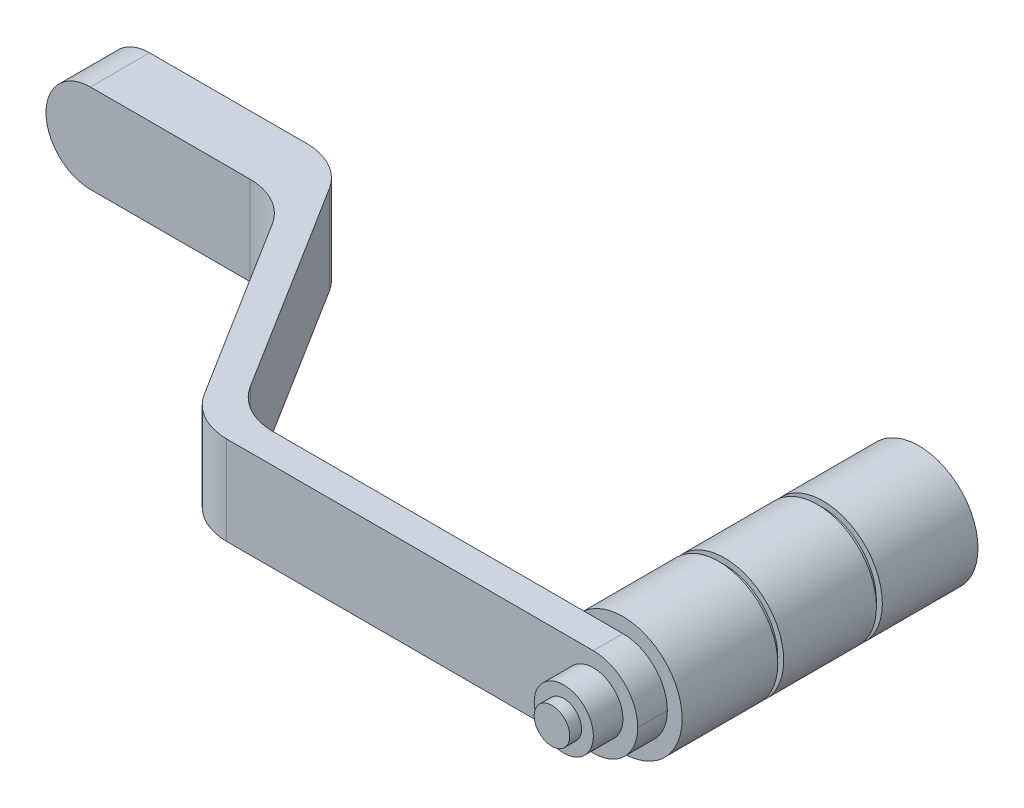
ISO-10303-21;
HEADER;
FILE_DESCRIPTION(('STEP AP214'),'2;1');
FILE_NAME('part.step','',(''),(''),'','','');
FILE_SCHEMA(('AUTOMOTIVE_DESIGN { 1 0 10303 214 1 1 1 1 }'));
ENDSEC;
DATA;
#1=APPLICATION_CONTEXT('core data for automotive mechanical design processes');
#2=APPLICATION_PROTOCOL_DEFINITION('international standard','automotive_design',2000,#1);
#3=PRODUCT_CONTEXT('',#1,'mechanical');
#4=PRODUCT('Part','Part','',(#3));
#5=PRODUCT_RELATED_PRODUCT_CATEGORY('part','',(#4));
#6=PRODUCT_DEFINITION_FORMATION('','',#4);
#7=PRODUCT_DEFINITION_CONTEXT('part definition',#1,'design');
#8=PRODUCT_DEFINITION('design','',#6,#7);
#9=PRODUCT_DEFINITION_SHAPE('','',#8);
#10=(LENGTH_UNIT() NAMED_UNIT(*) SI_UNIT(.MILLI.,.METRE.));
#11=(NAMED_UNIT(*) PLANE_ANGLE_UNIT() SI_UNIT($,.RADIAN.));
#12=(NAMED_UNIT(*) SI_UNIT($,.STERADIAN.) SOLID_ANGLE_UNIT());
#13=UNCERTAINTY_MEASURE_WITH_UNIT(LENGTH_MEASURE(1.E-05),#10,'distance_accuracy_value','');
#14=(GEOMETRIC_REPRESENTATION_CONTEXT(3) GLOBAL_UNCERTAINTY_ASSIGNED_CONTEXT((#13)) GLOBAL_UNIT_ASSIGNED_CONTEXT((#10,
#11,#12)) REPRESENTATION_CONTEXT('',''));
#15=CARTESIAN_POINT('',(0.,0.,0.));
#16=DIRECTION('',(0.,0.,1.));
#17=DIRECTION('',(1.,0.,0.));
#18=AXIS2_PLACEMENT_3D('',#15,#16,#17);
#19=CARTESIAN_POINT('',(9.525,0.,0.));
#20=DIRECTION('',(0.,0.,-1.));
#21=DIRECTION('',(-1.,0.,0.));
#22=AXIS2_PLACEMENT_3D('',#19,#20,#21);
#23=CYLINDRICAL_SURFACE('',#22,9.525);
#24=DIRECTION('',(0.,0.,1.));
#25=VECTOR('',#24,1.);
#26=CARTESIAN_POINT('',(0.,0.,-6.35));
#27=LINE('',#26,#25);
#28=CARTESIAN_POINT('',(0.,0.,-2.794));
#29=VERTEX_POINT('',#28);
#30=CARTESIAN_POINT('',(0.,0.,-6.35));
#31=VERTEX_POINT('',#30);
#32=EDGE_CURVE('E210',#29,#31,#27,.F.);
#33=ORIENTED_EDGE('',*,*,#32,.F.);
#34=CARTESIAN_POINT('',(9.52500000000011,0.,-2.794));
#35=DIRECTION('',(0.,0.,1.));
#36=DIRECTION('',(1.,0.,0.));
#37=AXIS2_PLACEMENT_3D('',#34,#35,#36);
#38=CIRCLE('',#37,9.52500000000011);
#39=CARTESIAN_POINT('',(0.567447725522335,3.2385,-2.794));
#40=VERTEX_POINT('',#39);
#41=EDGE_CURVE('E203',#40,#29,#38,.T.);
#42=ORIENTED_EDGE('',*,*,#41,.F.);
#43=DIRECTION('',(0.,0.,1.));
#44=VECTOR('',#43,1.);
#45=CARTESIAN_POINT('',(0.567447725522335,3.2385,-2.794));
#46=LINE('',#45,#44);
#47=CARTESIAN_POINT('',(0.567447725522335,3.2385,2.794));
#48=VERTEX_POINT('',#47);
#49=EDGE_CURVE('E188',#40,#48,#46,.T.);
#50=ORIENTED_EDGE('',*,*,#49,.T.);
#51=CARTESIAN_POINT('',(9.52500000000011,0.,2.794));
#52=DIRECTION('',(0.,0.,1.));
#53=DIRECTION('',(1.,0.,0.));
#54=AXIS2_PLACEMENT_3D('',#51,#52,#53);
#55=CIRCLE('',#54,9.52500000000011);
#56=CARTESIAN_POINT('',(0.,0.,2.794));
#57=VERTEX_POINT('',#56);
#58=EDGE_CURVE('E223',#48,#57,#55,.T.);
#59=ORIENTED_EDGE('',*,*,#58,.T.);
#60=CARTESIAN_POINT('',(0.,0.,6.35));
#61=VERTEX_POINT('',#60);
#62=EDGE_CURVE('E351',#61,#57,#27,.F.);
#63=ORIENTED_EDGE('',*,*,#62,.F.);
#64=CARTESIAN_POINT('',(9.525,0.,6.35));
#65=DIRECTION('',(0.,0.,-1.));
#66=DIRECTION('',(-1.,0.,0.));
#67=AXIS2_PLACEMENT_3D('',#64,#65,#66);
#68=CIRCLE('',#67,9.525);
#69=CARTESIAN_POINT('',(9.525,9.525,6.35));
#70=VERTEX_POINT('',#69);
#71=EDGE_CURVE('E338',#70,#61,#68,.F.);
#72=ORIENTED_EDGE('',*,*,#71,.F.);
#73=DIRECTION('',(0.,0.,1.));
#74=VECTOR('',#73,1.);
#75=CARTESIAN_POINT('',(9.525,9.525,6.35));
#76=LINE('',#75,#74);
#77=CARTESIAN_POINT('',(9.525,9.525,-6.35));
#78=VERTEX_POINT('',#77);
#79=EDGE_CURVE('E334',#78,#70,#76,.T.);
#80=ORIENTED_EDGE('',*,*,#79,.F.);
#81=CARTESIAN_POINT('',(9.525,0.,-6.35));
#82=DIRECTION('',(0.,0.,1.));
#83=DIRECTION('',(1.,0.,0.));
#84=AXIS2_PLACEMENT_3D('',#81,#82,#83);
#85=CIRCLE('',#84,9.525);
#86=EDGE_CURVE('E342',#31,#78,#85,.F.);
#87=ORIENTED_EDGE('',*,*,#86,.F.);
#88=EDGE_LOOP('',(#33,#42,#50,#59,#63,#72,#80,#87));
#89=FACE_BOUND('',#88,.T.);
#90=ADVANCED_FACE('F37',(#89),#23,.T.);
#91=CARTESIAN_POINT('',(9.525,0.,6.35));
#92=DIRECTION('',(0.,0.,1.));
#93=DIRECTION('',(1.,0.,0.));
#94=AXIS2_PLACEMENT_3D('',#91,#92,#93);
#95=CYLINDRICAL_SURFACE('',#94,9.525);
#96=DIRECTION('',(0.,0.,1.));
#97=VECTOR('',#96,1.);
#98=CARTESIAN_POINT('',(0.567447725522336,-3.2385,-2.794));
#99=LINE('',#98,#97);
#100=CARTESIAN_POINT('',(0.567447725522336,-3.2385,-2.794));
#101=VERTEX_POINT('',#100);
#102=CARTESIAN_POINT('',(0.567447725522334,-3.2385,2.794));
#103=VERTEX_POINT('',#102);
#104=EDGE_CURVE('E198',#101,#103,#99,.T.);
#105=ORIENTED_EDGE('',*,*,#104,.F.);
#106=CARTESIAN_POINT('',(9.525,0.,-2.794));
#107=DIRECTION('',(0.,0.,1.));
#108=DIRECTION('',(1.,0.,0.));
#109=AXIS2_PLACEMENT_3D('',#106,#107,#108);
#110=CIRCLE('',#109,9.525);
#111=EDGE_CURVE('E12',#101,#29,#110,.F.);
#112=ORIENTED_EDGE('',*,*,#111,.T.);
#113=ORIENTED_EDGE('',*,*,#32,.T.);
#114=CARTESIAN_POINT('',(9.525,0.,-6.35));
#115=DIRECTION('',(0.,0.,1.));
#116=DIRECTION('',(1.,0.,0.));
#117=AXIS2_PLACEMENT_3D('',#114,#115,#116);
#118=CIRCLE('',#117,9.525);
#119=CARTESIAN_POINT('',(9.525,-9.525,-6.35));
#120=VERTEX_POINT('',#119);
#121=EDGE_CURVE('E345',#120,#31,#118,.F.);
#122=ORIENTED_EDGE('',*,*,#121,.F.);
#123=DIRECTION('',(0.,0.,1.));
#124=VECTOR('',#123,1.);
#125=CARTESIAN_POINT('',(9.525,-9.525,0.));
#126=LINE('',#125,#124);
#127=CARTESIAN_POINT('',(9.525,-9.525,6.35));
#128=VERTEX_POINT('',#127);
#129=EDGE_CURVE('E323',#128,#120,#126,.F.);
#130=ORIENTED_EDGE('',*,*,#129,.F.);
#131=CARTESIAN_POINT('',(9.525,0.,6.35));
#132=DIRECTION('',(0.,0.,-1.));
#133=DIRECTION('',(-1.,0.,0.));
#134=AXIS2_PLACEMENT_3D('',#131,#132,#133);
#135=CIRCLE('',#134,9.525);
#136=EDGE_CURVE('E340',#61,#128,#135,.F.);
#137=ORIENTED_EDGE('',*,*,#136,.F.);
#138=ORIENTED_EDGE('',*,*,#62,.T.);
#139=CARTESIAN_POINT('',(9.525,0.,2.794));
#140=DIRECTION('',(0.,0.,1.));
#141=DIRECTION('',(1.,0.,0.));
#142=AXIS2_PLACEMENT_3D('',#139,#140,#141);
#143=CIRCLE('',#142,9.525);
#144=EDGE_CURVE('E45',#103,#57,#143,.F.);
#145=ORIENTED_EDGE('',*,*,#144,.F.);
#146=EDGE_LOOP('',(#105,#112,#113,#122,#130,#137,#138,#145));
#147=FACE_BOUND('',#146,.T.);
#148=ADVANCED_FACE('F398',(#147),#95,.T.);
#149=CARTESIAN_POINT('',(0.,9.525,6.35));
#150=DIRECTION('',(0.,0.,-1.));
#151=DIRECTION('',(-1.,0.,0.));
#152=AXIS2_PLACEMENT_3D('',#149,#150,#151);
#153=PLANE('',#152);
#154=DIRECTION('',(1.,0.,0.));
#155=VECTOR('',#154,1.);
#156=CARTESIAN_POINT('',(0.,-9.525,6.35));
#157=LINE('',#156,#155);
#158=CARTESIAN_POINT('',(43.7610549528601,-9.525,6.35));
#159=VERTEX_POINT('',#158);
#160=EDGE_CURVE('E301',#128,#159,#157,.T.);
#161=ORIENTED_EDGE('',*,*,#160,.T.);
#162=DIRECTION('',(0.,-1.,0.));
#163=VECTOR('',#162,1.);
#164=CARTESIAN_POINT('',(43.7610549528601,9.525,6.35));
#165=LINE('',#164,#163);
#166=CARTESIAN_POINT('',(43.7610549528601,9.525,6.35));
#167=VERTEX_POINT('',#166);
#168=EDGE_CURVE('E379',#159,#167,#165,.F.);
#169=ORIENTED_EDGE('',*,*,#168,.T.);
#170=DIRECTION('',(1.,0.,0.));
#171=VECTOR('',#170,1.);
#172=CARTESIAN_POINT('',(0.,9.525,6.35));
#173=LINE('',#172,#171);
#174=EDGE_CURVE('E284',#70,#167,#173,.T.);
#175=ORIENTED_EDGE('',*,*,#174,.F.);
#176=ORIENTED_EDGE('',*,*,#71,.T.);
#177=ORIENTED_EDGE('',*,*,#136,.T.);
#178=EDGE_LOOP('',(#161,#169,#175,#176,#177));
#179=FACE_BOUND('',#178,.T.);
#180=ADVANCED_FACE('F403',(#179),#153,.F.);
#181=CARTESIAN_POINT('',(50.8,9.525,6.35));
#182=DIRECTION('',(0.847998304005088,0.,-0.52999894000318));
#183=DIRECTION('',(-0.52999894000318,0.,-0.847998304005088));
#184=AXIS2_PLACEMENT_3D('',#181,#182,#183);
#185=PLANE('',#184);
#186=DIRECTION('',(0.52999894000318,0.,0.847998304005088));
#187=VECTOR('',#186,1.);
#188=CARTESIAN_POINT('',(50.8,-9.525,6.35));
#189=LINE('',#188,#187);
#190=CARTESIAN_POINT('',(54.5306334137248,-9.525,12.3190134619596));
#191=VERTEX_POINT('',#190);
#192=CARTESIAN_POINT('',(78.8193665862753,-9.525,51.1809865380404));
#193=VERTEX_POINT('',#192);
#194=EDGE_CURVE('E304',#191,#193,#189,.T.);
#195=ORIENTED_EDGE('',*,*,#194,.T.);
#196=DIRECTION('',(0.,-1.,0.));
#197=VECTOR('',#196,1.);
#198=CARTESIAN_POINT('',(78.8193665862753,9.525,51.1809865380404));
#199=LINE('',#198,#197);
#200=CARTESIAN_POINT('',(78.8193665862753,9.525,51.1809865380404));
#201=VERTEX_POINT('',#200);
#202=EDGE_CURVE('E377',#193,#201,#199,.F.);
#203=ORIENTED_EDGE('',*,*,#202,.T.);
#204=DIRECTION('',(0.52999894000318,0.,0.847998304005088));
#205=VECTOR('',#204,1.);
#206=CARTESIAN_POINT('',(50.8,9.525,6.35));
#207=LINE('',#206,#205);
#208=CARTESIAN_POINT('',(54.5306334137248,9.525,12.3190134619596));
#209=VERTEX_POINT('',#208);
#210=EDGE_CURVE('E287',#209,#201,#207,.T.);
#211=ORIENTED_EDGE('',*,*,#210,.F.);
#212=DIRECTION('',(0.,-1.,0.));
#213=VECTOR('',#212,1.);
#214=CARTESIAN_POINT('',(54.5306334137248,-9.525,12.3190134619596));
#215=LINE('',#214,#213);
#216=EDGE_CURVE('E374',#209,#191,#215,.T.);
#217=ORIENTED_EDGE('',*,*,#216,.T.);
#218=EDGE_LOOP('',(#195,#203,#211,#217));
#219=FACE_BOUND('',#218,.T.);
#220=ADVANCED_FACE('F415',(#219),#185,.F.);
#221=CARTESIAN_POINT('',(82.55,9.525,57.15));
#222=DIRECTION('',(0.,0.,-1.));
#223=DIRECTION('',(-1.,0.,0.));
#224=AXIS2_PLACEMENT_3D('',#221,#222,#223);
#225=PLANE('',#224);
#226=CARTESIAN_POINT('',(168.275,0.,57.15));
#227=DIRECTION('',(0.,0.,-1.));
#228=DIRECTION('',(-1.,0.,0.));
#229=AXIS2_PLACEMENT_3D('',#226,#227,#228);
#230=CIRCLE('',#229,6.35);
#231=CARTESIAN_POINT('',(161.925,0.,57.15));
#232=VERTEX_POINT('',#231);
#233=EDGE_CURVE('E250',#232,#232,#230,.F.);
#234=ORIENTED_EDGE('',*,*,#233,.F.);
#235=EDGE_LOOP('',(#234));
#236=FACE_BOUND('',#235,.T.);
#237=DIRECTION('',(1.,0.,0.));
#238=VECTOR('',#237,1.);
#239=CARTESIAN_POINT('',(82.55,9.525,57.15));
#240=LINE('',#239,#238);
#241=CARTESIAN_POINT('',(89.5889450471399,9.525,57.15));
#242=VERTEX_POINT('',#241);
#243=CARTESIAN_POINT('',(168.275,9.525,57.15));
#244=VERTEX_POINT('',#243);
#245=EDGE_CURVE('E291',#242,#244,#240,.T.);
#246=ORIENTED_EDGE('',*,*,#245,.F.);
#247=DIRECTION('',(0.,-1.,0.));
#248=VECTOR('',#247,1.);
#249=CARTESIAN_POINT('',(89.5889450471399,9.525,57.15));
#250=LINE('',#249,#248);
#251=CARTESIAN_POINT('',(89.5889450471399,-9.525,57.15));
#252=VERTEX_POINT('',#251);
#253=EDGE_CURVE('E371',#242,#252,#250,.T.);
#254=ORIENTED_EDGE('',*,*,#253,.T.);
#255=DIRECTION('',(1.,0.,0.));
#256=VECTOR('',#255,1.);
#257=CARTESIAN_POINT('',(82.55,-9.525,57.15));
#258=LINE('',#257,#256);
#259=CARTESIAN_POINT('',(168.275,-9.525,57.15));
#260=VERTEX_POINT('',#259);
#261=EDGE_CURVE('E308',#252,#260,#258,.T.);
#262=ORIENTED_EDGE('',*,*,#261,.T.);
#263=CARTESIAN_POINT('',(168.275,0.,57.15));
#264=DIRECTION('',(0.,0.,-1.));
#265=DIRECTION('',(-1.,0.,0.));
#266=AXIS2_PLACEMENT_3D('',#263,#264,#265);
#267=CIRCLE('',#266,9.525);
#268=CARTESIAN_POINT('',(177.8,0.,57.15));
#269=VERTEX_POINT('',#268);
#270=EDGE_CURVE('E332',#260,#269,#267,.F.);
#271=ORIENTED_EDGE('',*,*,#270,.T.);
#272=CARTESIAN_POINT('',(168.275,0.,57.15));
#273=DIRECTION('',(0.,0.,-1.));
#274=DIRECTION('',(-1.,0.,0.));
#275=AXIS2_PLACEMENT_3D('',#272,#273,#274);
#276=CIRCLE('',#275,9.525);
#277=EDGE_CURVE('E329',#269,#244,#276,.F.);
#278=ORIENTED_EDGE('',*,*,#277,.T.);
#279=EDGE_LOOP('',(#246,#254,#262,#271,#278));
#280=FACE_BOUND('',#279,.T.);
#281=ADVANCED_FACE('F426',(#236,#280),#225,.F.);
#282=CARTESIAN_POINT('',(86.0694725235699,9.525,50.8));
#283=DIRECTION('',(0.,0.,1.));
#284=DIRECTION('',(1.,0.,0.));
#285=AXIS2_PLACEMENT_3D('',#282,#283,#284);
#286=PLANE('',#285);
#287=CARTESIAN_POINT('',(168.275,0.,50.8));
#288=DIRECTION('',(0.,0.,-1.));
#289=DIRECTION('',(-1.,0.,0.));
#290=AXIS2_PLACEMENT_3D('',#287,#288,#289);
#291=CIRCLE('',#290,12.7);
#292=CARTESIAN_POINT('',(159.87473958737,-9.525,50.8));
#293=VERTEX_POINT('',#292);
#294=CARTESIAN_POINT('',(159.87473958737,9.525,50.8));
#295=VERTEX_POINT('',#294);
#296=EDGE_CURVE('E275',#293,#295,#291,.T.);
#297=ORIENTED_EDGE('',*,*,#296,.F.);
#298=DIRECTION('',(-1.,0.,0.));
#299=VECTOR('',#298,1.);
#300=CARTESIAN_POINT('',(86.0694725235699,-9.525,50.8));
#301=LINE('',#300,#299);
#302=CARTESIAN_POINT('',(93.1084175707098,-9.525,50.8));
#303=VERTEX_POINT('',#302);
#304=EDGE_CURVE('E310',#293,#303,#301,.T.);
#305=ORIENTED_EDGE('',*,*,#304,.T.);
#306=DIRECTION('',(0.,-1.,0.));
#307=VECTOR('',#306,1.);
#308=CARTESIAN_POINT('',(93.1084175707098,9.525,50.8));
#309=LINE('',#308,#307);
#310=CARTESIAN_POINT('',(93.1084175707098,9.525,50.8));
#311=VERTEX_POINT('',#310);
#312=EDGE_CURVE('E369',#303,#311,#309,.F.);
#313=ORIENTED_EDGE('',*,*,#312,.T.);
#314=DIRECTION('',(-1.,0.,0.));
#315=VECTOR('',#314,1.);
#316=CARTESIAN_POINT('',(86.0694725235699,9.525,50.8));
#317=LINE('',#316,#315);
#318=EDGE_CURVE('E60',#295,#311,#317,.T.);
#319=ORIENTED_EDGE('',*,*,#318,.F.);
#320=EDGE_LOOP('',(#297,#305,#313,#319));
#321=FACE_BOUND('',#320,.T.);
#322=ADVANCED_FACE('F487',(#321),#286,.F.);
#323=CARTESIAN_POINT('',(50.3507225235699,9.525,-6.35));
#324=DIRECTION('',(-0.847998304005088,0.,0.52999894000318));
#325=DIRECTION('',(0.52999894000318,0.,0.847998304005088));
#326=AXIS2_PLACEMENT_3D('',#323,#324,#325);
#327=PLANE('',#326);
#328=DIRECTION('',(-0.52999894000318,0.,-0.847998304005088));
#329=VECTOR('',#328,1.);
#330=CARTESIAN_POINT('',(50.3507225235699,-9.525,-6.35));
#331=LINE('',#330,#329);
#332=CARTESIAN_POINT('',(82.3388391098452,-9.525,44.8309865380404));
#333=VERTEX_POINT('',#332);
#334=CARTESIAN_POINT('',(54.0813559372947,-9.525,-0.380986538040386));
#335=VERTEX_POINT('',#334);
#336=EDGE_CURVE('E314',#333,#335,#331,.T.);
#337=ORIENTED_EDGE('',*,*,#336,.T.);
#338=DIRECTION('',(0.,-1.,0.));
#339=VECTOR('',#338,1.);
#340=CARTESIAN_POINT('',(54.0813559372947,9.525,-0.380986538040387));
#341=LINE('',#340,#339);
#342=CARTESIAN_POINT('',(54.0813559372947,9.525,-0.380986538040386));
#343=VERTEX_POINT('',#342);
#344=EDGE_CURVE('E363',#335,#343,#341,.F.);
#345=ORIENTED_EDGE('',*,*,#344,.T.);
#346=DIRECTION('',(-0.52999894000318,0.,-0.847998304005088));
#347=VECTOR('',#346,1.);
#348=CARTESIAN_POINT('',(50.3507225235699,9.525,-6.35));
#349=LINE('',#348,#347);
#350=CARTESIAN_POINT('',(82.3388391098452,9.525,44.8309865380404));
#351=VERTEX_POINT('',#350);
#352=EDGE_CURVE('E295',#351,#343,#349,.T.);
#353=ORIENTED_EDGE('',*,*,#352,.F.);
#354=DIRECTION('',(0.,-1.,0.));
#355=VECTOR('',#354,1.);
#356=CARTESIAN_POINT('',(82.3388391098452,-9.525,44.8309865380404));
#357=LINE('',#356,#355);
#358=EDGE_CURVE('E360',#351,#333,#357,.T.);
#359=ORIENTED_EDGE('',*,*,#358,.T.);
#360=EDGE_LOOP('',(#337,#345,#353,#359));
#361=FACE_BOUND('',#360,.T.);
#362=ADVANCED_FACE('F492',(#361),#327,.F.);
#363=CARTESIAN_POINT('',(0.,9.525,-6.35));
#364=DIRECTION('',(0.,0.,1.));
#365=DIRECTION('',(1.,0.,0.));
#366=AXIS2_PLACEMENT_3D('',#363,#364,#365);
#367=PLANE('',#366);
#368=DIRECTION('',(-1.,0.,0.));
#369=VECTOR('',#368,1.);
#370=CARTESIAN_POINT('',(0.,9.525,-6.35));
#371=LINE('',#370,#369);
#372=CARTESIAN_POINT('',(43.3117774764301,9.525,-6.35));
#373=VERTEX_POINT('',#372);
#374=EDGE_CURVE('E298',#373,#78,#371,.T.);
#375=ORIENTED_EDGE('',*,*,#374,.F.);
#376=DIRECTION('',(0.,-1.,0.));
#377=VECTOR('',#376,1.);
#378=CARTESIAN_POINT('',(43.3117774764301,9.525,-6.35));
#379=LINE('',#378,#377);
#380=CARTESIAN_POINT('',(43.3117774764301,-9.525,-6.35));
#381=VERTEX_POINT('',#380);
#382=EDGE_CURVE('E348',#373,#381,#379,.T.);
#383=ORIENTED_EDGE('',*,*,#382,.T.);
#384=DIRECTION('',(-1.,0.,0.));
#385=VECTOR('',#384,1.);
#386=CARTESIAN_POINT('',(0.,-9.525,-6.35));
#387=LINE('',#386,#385);
#388=EDGE_CURVE('E288',#381,#120,#387,.T.);
#389=ORIENTED_EDGE('',*,*,#388,.T.);
#390=ORIENTED_EDGE('',*,*,#121,.T.);
#391=ORIENTED_EDGE('',*,*,#86,.T.);
#392=EDGE_LOOP('',(#375,#383,#389,#390,#391));
#393=FACE_BOUND('',#392,.T.);
#394=ADVANCED_FACE('F505',(#393),#367,.F.);
#395=CARTESIAN_POINT('',(0.,9.525,0.));
#396=DIRECTION('',(0.,1.,0.));
#397=DIRECTION('',(0.,0.,1.));
#398=AXIS2_PLACEMENT_3D('',#395,#396,#397);
#399=PLANE('',#398);
#400=ORIENTED_EDGE('',*,*,#352,.T.);
#401=CARTESIAN_POINT('',(43.3117774764301,9.525,6.35));
#402=DIRECTION('',(0.,1.,0.));
#403=DIRECTION('',(0.,0.,1.));
#404=AXIS2_PLACEMENT_3D('',#401,#402,#403);
#405=CIRCLE('',#404,12.7);
#406=EDGE_CURVE('E367',#343,#373,#405,.T.);
#407=ORIENTED_EDGE('',*,*,#406,.T.);
#408=ORIENTED_EDGE('',*,*,#374,.T.);
#409=ORIENTED_EDGE('',*,*,#79,.T.);
#410=ORIENTED_EDGE('',*,*,#174,.T.);
#411=CARTESIAN_POINT('',(43.7610549528601,9.525,19.05));
#412=DIRECTION('',(0.,1.,0.));
#413=DIRECTION('',(0.,0.,1.));
#414=AXIS2_PLACEMENT_3D('',#411,#412,#413);
#415=CIRCLE('',#414,12.7);
#416=EDGE_CURVE('E388',#167,#209,#415,.F.);
#417=ORIENTED_EDGE('',*,*,#416,.T.);
#418=ORIENTED_EDGE('',*,*,#210,.T.);
#419=CARTESIAN_POINT('',(89.5889450471399,9.525,44.45));
#420=DIRECTION('',(0.,1.,0.));
#421=DIRECTION('',(0.,0.,1.));
#422=AXIS2_PLACEMENT_3D('',#419,#420,#421);
#423=CIRCLE('',#422,12.7);
#424=EDGE_CURVE('E365',#201,#242,#423,.T.);
#425=ORIENTED_EDGE('',*,*,#424,.T.);
#426=ORIENTED_EDGE('',*,*,#245,.T.);
#427=DIRECTION('',(0.,0.,-1.));
#428=VECTOR('',#427,1.);
#429=CARTESIAN_POINT('',(168.275,9.525,50.8));
#430=LINE('',#429,#428);
#431=CARTESIAN_POINT('',(168.275,9.525,50.8));
#432=VERTEX_POINT('',#431);
#433=EDGE_CURVE('E336',#244,#432,#430,.T.);
#434=ORIENTED_EDGE('',*,*,#433,.T.);
#435=EDGE_CURVE('E293',#432,#295,#317,.T.);
#436=ORIENTED_EDGE('',*,*,#435,.T.);
#437=ORIENTED_EDGE('',*,*,#318,.T.);
#438=CARTESIAN_POINT('',(93.1084175707098,9.525,38.1));
#439=DIRECTION('',(0.,1.,0.));
#440=DIRECTION('',(0.,0.,1.));
#441=AXIS2_PLACEMENT_3D('',#438,#439,#440);
#442=CIRCLE('',#441,12.7);
#443=EDGE_CURVE('E384',#311,#351,#442,.F.);
#444=ORIENTED_EDGE('',*,*,#443,.T.);
#445=EDGE_LOOP('',(#400,#407,#408,#409,#410,#417,#418,#425,#426,#434,#436,#437,#444));
#446=FACE_BOUND('',#445,.T.);
#447=ADVANCED_FACE('F419',(#446),#399,.T.);
#448=CARTESIAN_POINT('',(0.,-9.525,0.));
#449=DIRECTION('',(0.,1.,0.));
#450=DIRECTION('',(0.,0.,1.));
#451=AXIS2_PLACEMENT_3D('',#448,#449,#450);
#452=PLANE('',#451);
#453=ORIENTED_EDGE('',*,*,#388,.F.);
#454=CARTESIAN_POINT('',(43.3117774764301,-9.525,6.35));
#455=DIRECTION('',(0.,1.,0.));
#456=DIRECTION('',(0.,0.,1.));
#457=AXIS2_PLACEMENT_3D('',#454,#455,#456);
#458=CIRCLE('',#457,12.7);
#459=EDGE_CURVE('E358',#381,#335,#458,.F.);
#460=ORIENTED_EDGE('',*,*,#459,.T.);
#461=ORIENTED_EDGE('',*,*,#336,.F.);
#462=CARTESIAN_POINT('',(93.1084175707098,-9.525,38.1));
#463=DIRECTION('',(0.,1.,0.));
#464=DIRECTION('',(0.,0.,1.));
#465=AXIS2_PLACEMENT_3D('',#462,#463,#464);
#466=CIRCLE('',#465,12.7);
#467=EDGE_CURVE('E381',#333,#303,#466,.T.);
#468=ORIENTED_EDGE('',*,*,#467,.T.);
#469=ORIENTED_EDGE('',*,*,#304,.F.);
#470=CARTESIAN_POINT('',(168.275,-9.525,50.8));
#471=VERTEX_POINT('',#470);
#472=EDGE_CURVE('E311',#471,#293,#301,.T.);
#473=ORIENTED_EDGE('',*,*,#472,.F.);
#474=DIRECTION('',(0.,0.,-1.));
#475=VECTOR('',#474,1.);
#476=CARTESIAN_POINT('',(168.275,-9.525,0.));
#477=LINE('',#476,#475);
#478=EDGE_CURVE('E326',#471,#260,#477,.F.);
#479=ORIENTED_EDGE('',*,*,#478,.T.);
#480=ORIENTED_EDGE('',*,*,#261,.F.);
#481=CARTESIAN_POINT('',(89.5889450471399,-9.525,44.45));
#482=DIRECTION('',(0.,1.,0.));
#483=DIRECTION('',(0.,0.,1.));
#484=AXIS2_PLACEMENT_3D('',#481,#482,#483);
#485=CIRCLE('',#484,12.7);
#486=EDGE_CURVE('E356',#252,#193,#485,.F.);
#487=ORIENTED_EDGE('',*,*,#486,.T.);
#488=ORIENTED_EDGE('',*,*,#194,.F.);
#489=CARTESIAN_POINT('',(43.7610549528601,-9.525,19.05));
#490=DIRECTION('',(0.,1.,0.));
#491=DIRECTION('',(0.,0.,1.));
#492=AXIS2_PLACEMENT_3D('',#489,#490,#491);
#493=CIRCLE('',#492,12.7);
#494=EDGE_CURVE('E386',#191,#159,#493,.T.);
#495=ORIENTED_EDGE('',*,*,#494,.T.);
#496=ORIENTED_EDGE('',*,*,#160,.F.);
#497=ORIENTED_EDGE('',*,*,#129,.T.);
#498=EDGE_LOOP('',(#453,#460,#461,#468,#469,#473,#479,#480,#487,#488,#495,#496,#497));
#499=FACE_BOUND('',#498,.T.);
#500=ADVANCED_FACE('F408',(#499),#452,.F.);
#501=CARTESIAN_POINT('',(168.275,0.,0.));
#502=DIRECTION('',(0.,0.,1.));
#503=DIRECTION('',(1.,0.,0.));
#504=AXIS2_PLACEMENT_3D('',#501,#502,#503);
#505=CYLINDRICAL_SURFACE('',#504,9.525);
#506=ORIENTED_EDGE('',*,*,#433,.F.);
#507=ORIENTED_EDGE('',*,*,#277,.F.);
#508=DIRECTION('',(0.,0.,-1.));
#509=VECTOR('',#508,1.);
#510=CARTESIAN_POINT('',(177.8,0.,57.15));
#511=LINE('',#510,#509);
#512=CARTESIAN_POINT('',(177.8,0.,50.8));
#513=VERTEX_POINT('',#512);
#514=EDGE_CURVE('E305',#513,#269,#511,.F.);
#515=ORIENTED_EDGE('',*,*,#514,.F.);
#516=CARTESIAN_POINT('',(168.275,0.,50.8));
#517=DIRECTION('',(0.,0.,1.));
#518=DIRECTION('',(1.,0.,0.));
#519=AXIS2_PLACEMENT_3D('',#516,#517,#518);
#520=CIRCLE('',#519,9.525);
#521=EDGE_CURVE('E300',#432,#513,#520,.F.);
#522=ORIENTED_EDGE('',*,*,#521,.F.);
#523=EDGE_LOOP('',(#506,#507,#515,#522));
#524=FACE_BOUND('',#523,.T.);
#525=ADVANCED_FACE('F436',(#524),#505,.T.);
#526=CARTESIAN_POINT('',(168.275,0.,57.15));
#527=DIRECTION('',(0.,0.,-1.));
#528=DIRECTION('',(-1.,0.,0.));
#529=AXIS2_PLACEMENT_3D('',#526,#527,#528);
#530=CYLINDRICAL_SURFACE('',#529,9.525);
#531=ORIENTED_EDGE('',*,*,#270,.F.);
#532=ORIENTED_EDGE('',*,*,#478,.F.);
#533=CARTESIAN_POINT('',(168.275,0.,50.8));
#534=DIRECTION('',(0.,0.,1.));
#535=DIRECTION('',(1.,0.,0.));
#536=AXIS2_PLACEMENT_3D('',#533,#534,#535);
#537=CIRCLE('',#536,9.525);
#538=EDGE_CURVE('E320',#513,#471,#537,.F.);
#539=ORIENTED_EDGE('',*,*,#538,.F.);
#540=ORIENTED_EDGE('',*,*,#514,.T.);
#541=EDGE_LOOP('',(#531,#532,#539,#540));
#542=FACE_BOUND('',#541,.T.);
#543=ADVANCED_FACE('F432',(#542),#530,.T.);
#544=CARTESIAN_POINT('',(43.3117774764301,9.525,6.35));
#545=DIRECTION('',(0.,-1.,0.));
#546=DIRECTION('',(0.,0.,-1.));
#547=AXIS2_PLACEMENT_3D('',#544,#545,#546);
#548=CYLINDRICAL_SURFACE('',#547,12.7);
#549=ORIENTED_EDGE('',*,*,#406,.F.);
#550=ORIENTED_EDGE('',*,*,#344,.F.);
#551=ORIENTED_EDGE('',*,*,#459,.F.);
#552=ORIENTED_EDGE('',*,*,#382,.F.);
#553=EDGE_LOOP('',(#549,#550,#551,#552));
#554=FACE_BOUND('',#553,.T.);
#555=ADVANCED_FACE('F465',(#554),#548,.T.);
#556=CARTESIAN_POINT('',(93.1084175707098,9.525,38.1));
#557=DIRECTION('',(0.,1.,0.));
#558=DIRECTION('',(0.,0.,1.));
#559=AXIS2_PLACEMENT_3D('',#556,#557,#558);
#560=CYLINDRICAL_SURFACE('',#559,12.7);
#561=ORIENTED_EDGE('',*,*,#443,.F.);
#562=ORIENTED_EDGE('',*,*,#312,.F.);
#563=ORIENTED_EDGE('',*,*,#467,.F.);
#564=ORIENTED_EDGE('',*,*,#358,.F.);
#565=EDGE_LOOP('',(#561,#562,#563,#564));
#566=FACE_BOUND('',#565,.T.);
#567=ADVANCED_FACE('F468',(#566),#560,.F.);
#568=CARTESIAN_POINT('',(89.5889450471399,9.525,44.45));
#569=DIRECTION('',(0.,-1.,0.));
#570=DIRECTION('',(0.,0.,-1.));
#571=AXIS2_PLACEMENT_3D('',#568,#569,#570);
#572=CYLINDRICAL_SURFACE('',#571,12.7);
#573=ORIENTED_EDGE('',*,*,#424,.F.);
#574=ORIENTED_EDGE('',*,*,#202,.F.);
#575=ORIENTED_EDGE('',*,*,#486,.F.);
#576=ORIENTED_EDGE('',*,*,#253,.F.);
#577=EDGE_LOOP('',(#573,#574,#575,#576));
#578=FACE_BOUND('',#577,.T.);
#579=ADVANCED_FACE('F423',(#578),#572,.T.);
#580=CARTESIAN_POINT('',(43.7610549528601,9.525,19.05));
#581=DIRECTION('',(0.,1.,0.));
#582=DIRECTION('',(0.,0.,1.));
#583=AXIS2_PLACEMENT_3D('',#580,#581,#582);
#584=CYLINDRICAL_SURFACE('',#583,12.7);
#585=ORIENTED_EDGE('',*,*,#416,.F.);
#586=ORIENTED_EDGE('',*,*,#168,.F.);
#587=ORIENTED_EDGE('',*,*,#494,.F.);
#588=ORIENTED_EDGE('',*,*,#216,.F.);
#589=EDGE_LOOP('',(#585,#586,#587,#588));
#590=FACE_BOUND('',#589,.T.);
#591=ADVANCED_FACE('F39',(#590),#584,.F.);
#592=CARTESIAN_POINT('',(168.275,0.,50.8));
#593=DIRECTION('',(0.,0.,-1.));
#594=DIRECTION('',(-1.,0.,0.));
#595=AXIS2_PLACEMENT_3D('',#592,#593,#594);
#596=PLANE('',#595);
#597=ORIENTED_EDGE('',*,*,#435,.F.);
#598=ORIENTED_EDGE('',*,*,#521,.T.);
#599=ORIENTED_EDGE('',*,*,#538,.T.);
#600=ORIENTED_EDGE('',*,*,#472,.T.);
#601=EDGE_CURVE('E278',#295,#293,#291,.T.);
#602=ORIENTED_EDGE('',*,*,#601,.F.);
#603=EDGE_LOOP('',(#597,#598,#599,#600,#602));
#604=FACE_BOUND('',#603,.T.);
#605=ADVANCED_FACE('F444',(#604),#596,.F.);
#606=CARTESIAN_POINT('',(168.275,0.,-54.9710244842766));
#607=DIRECTION('',(0.,0.,1.));
#608=DIRECTION('',(1.,0.,0.));
#609=AXIS2_PLACEMENT_3D('',#606,#607,#608);
#610=CYLINDRICAL_SURFACE('',#609,12.7);
#611=CARTESIAN_POINT('',(168.275,0.,30.2683333333333));
#612=DIRECTION('',(0.,0.,1.));
#613=DIRECTION('',(1.,0.,0.));
#614=AXIS2_PLACEMENT_3D('',#611,#612,#613);
#615=CIRCLE('',#614,12.7);
#616=CARTESIAN_POINT('',(180.975,0.,30.2683333333333));
#617=VERTEX_POINT('',#616);
#618=EDGE_CURVE('E269',#617,#617,#615,.T.);
#619=ORIENTED_EDGE('',*,*,#618,.T.);
#620=EDGE_LOOP('',(#619));
#621=FACE_BOUND('',#620,.T.);
#622=ORIENTED_EDGE('',*,*,#601,.T.);
#623=ORIENTED_EDGE('',*,*,#296,.T.);
#624=EDGE_LOOP('',(#622,#623));
#625=FACE_BOUND('',#624,.T.);
#626=ADVANCED_FACE('F443',(#621,#625),#610,.T.);
#627=CARTESIAN_POINT('',(168.275,0.,28.9983333333333));
#628=DIRECTION('',(0.,0.,1.));
#629=DIRECTION('',(1.,0.,0.));
#630=AXIS2_PLACEMENT_3D('',#627,#628,#629);
#631=PLANE('',#630);
#632=CARTESIAN_POINT('',(168.275,0.,28.9983333333333));
#633=DIRECTION('',(0.,0.,1.));
#634=DIRECTION('',(1.,0.,0.));
#635=AXIS2_PLACEMENT_3D('',#632,#633,#634);
#636=CIRCLE('',#635,11.43);
#637=CARTESIAN_POINT('',(179.705,0.,28.9983333333333));
#638=VERTEX_POINT('',#637);
#639=EDGE_CURVE('E266',#638,#638,#636,.T.);
#640=ORIENTED_EDGE('',*,*,#639,.F.);
#641=EDGE_LOOP('',(#640));
#642=FACE_BOUND('',#641,.T.);
#643=CARTESIAN_POINT('',(168.275,0.,28.9983333333333));
#644=DIRECTION('',(0.,0.,1.));
#645=DIRECTION('',(1.,0.,0.));
#646=AXIS2_PLACEMENT_3D('',#643,#644,#645);
#647=CIRCLE('',#646,12.7);
#648=CARTESIAN_POINT('',(180.975,0.,28.9983333333333));
#649=VERTEX_POINT('',#648);
#650=EDGE_CURVE('E272',#649,#649,#647,.T.);
#651=ORIENTED_EDGE('',*,*,#650,.T.);
#652=EDGE_LOOP('',(#651));
#653=FACE_BOUND('',#652,.T.);
#654=ADVANCED_FACE('F451',(#642,#653),#631,.T.);
#655=CARTESIAN_POINT('',(168.275,0.,30.2683333333333));
#656=DIRECTION('',(0.,0.,1.));
#657=DIRECTION('',(1.,0.,0.));
#658=AXIS2_PLACEMENT_3D('',#655,#656,#657);
#659=PLANE('',#658);
#660=CARTESIAN_POINT('',(168.275,0.,30.2683333333333));
#661=DIRECTION('',(0.,0.,1.));
#662=DIRECTION('',(1.,0.,0.));
#663=AXIS2_PLACEMENT_3D('',#660,#661,#662);
#664=CIRCLE('',#663,11.43);
#665=CARTESIAN_POINT('',(179.705,0.,30.2683333333333));
#666=VERTEX_POINT('',#665);
#667=EDGE_CURVE('E263',#666,#666,#664,.T.);
#668=ORIENTED_EDGE('',*,*,#667,.T.);
#669=EDGE_LOOP('',(#668));
#670=FACE_BOUND('',#669,.T.);
#671=ORIENTED_EDGE('',*,*,#618,.F.);
#672=EDGE_LOOP('',(#671));
#673=FACE_BOUND('',#672,.T.);
#674=ADVANCED_FACE('F562',(#670,#673),#659,.F.);
#675=CARTESIAN_POINT('',(168.275,0.,28.9983333333333));
#676=DIRECTION('',(0.,0.,1.));
#677=DIRECTION('',(1.,0.,0.));
#678=AXIS2_PLACEMENT_3D('',#675,#676,#677);
#679=CYLINDRICAL_SURFACE('',#678,11.43);
#680=ORIENTED_EDGE('',*,*,#639,.T.);
#681=EDGE_LOOP('',(#680));
#682=FACE_BOUND('',#681,.T.);
#683=ORIENTED_EDGE('',*,*,#667,.F.);
#684=EDGE_LOOP('',(#683));
#685=FACE_BOUND('',#684,.T.);
#686=ADVANCED_FACE('F572',(#682,#685),#679,.T.);
#687=CARTESIAN_POINT('',(168.275,0.,9.10166666666668));
#688=DIRECTION('',(0.,0.,1.));
#689=DIRECTION('',(1.,0.,0.));
#690=AXIS2_PLACEMENT_3D('',#687,#688,#689);
#691=CIRCLE('',#690,12.7);
#692=CARTESIAN_POINT('',(180.975,0.,9.10166666666668));
#693=VERTEX_POINT('',#692);
#694=EDGE_CURVE('E257',#693,#693,#691,.T.);
#695=ORIENTED_EDGE('',*,*,#694,.T.);
#696=EDGE_LOOP('',(#695));
#697=FACE_BOUND('',#696,.T.);
#698=ORIENTED_EDGE('',*,*,#650,.F.);
#699=EDGE_LOOP('',(#698));
#700=FACE_BOUND('',#699,.T.);
#701=ADVANCED_FACE('F455',(#697,#700),#610,.T.);
#702=CARTESIAN_POINT('',(168.275,0.,7.83166666666668));
#703=DIRECTION('',(0.,0.,1.));
#704=DIRECTION('',(1.,0.,0.));
#705=AXIS2_PLACEMENT_3D('',#702,#703,#704);
#706=PLANE('',#705);
#707=CARTESIAN_POINT('',(168.275,0.,7.83166666666668));
#708=DIRECTION('',(0.,0.,1.));
#709=DIRECTION('',(1.,0.,0.));
#710=AXIS2_PLACEMENT_3D('',#707,#708,#709);
#711=CIRCLE('',#710,11.43);
#712=CARTESIAN_POINT('',(179.705,0.,7.83166666666668));
#713=VERTEX_POINT('',#712);
#714=EDGE_CURVE('E254',#713,#713,#711,.T.);
#715=ORIENTED_EDGE('',*,*,#714,.F.);
#716=EDGE_LOOP('',(#715));
#717=FACE_BOUND('',#716,.T.);
#718=CARTESIAN_POINT('',(168.275,0.,7.83166666666668));
#719=DIRECTION('',(0.,0.,1.));
#720=DIRECTION('',(1.,0.,0.));
#721=AXIS2_PLACEMENT_3D('',#718,#719,#720);
#722=CIRCLE('',#721,12.7);
#723=CARTESIAN_POINT('',(180.975,0.,7.83166666666668));
#724=VERTEX_POINT('',#723);
#725=EDGE_CURVE('E260',#724,#724,#722,.T.);
#726=ORIENTED_EDGE('',*,*,#725,.T.);
#727=EDGE_LOOP('',(#726));
#728=FACE_BOUND('',#727,.T.);
#729=ADVANCED_FACE('F591',(#717,#728),#706,.T.);
#730=CARTESIAN_POINT('',(168.275,0.,9.10166666666668));
#731=DIRECTION('',(0.,0.,1.));
#732=DIRECTION('',(1.,0.,0.));
#733=AXIS2_PLACEMENT_3D('',#730,#731,#732);
#734=PLANE('',#733);
#735=CARTESIAN_POINT('',(168.275,0.,9.10166666666668));
#736=DIRECTION('',(0.,0.,1.));
#737=DIRECTION('',(1.,0.,0.));
#738=AXIS2_PLACEMENT_3D('',#735,#736,#737);
#739=CIRCLE('',#738,11.43);
#740=CARTESIAN_POINT('',(179.705,0.,9.10166666666668));
#741=VERTEX_POINT('',#740);
#742=EDGE_CURVE('E253',#741,#741,#739,.T.);
#743=ORIENTED_EDGE('',*,*,#742,.T.);
#744=EDGE_LOOP('',(#743));
#745=FACE_BOUND('',#744,.T.);
#746=ORIENTED_EDGE('',*,*,#694,.F.);
#747=EDGE_LOOP('',(#746));
#748=FACE_BOUND('',#747,.T.);
#749=ADVANCED_FACE('F600',(#745,#748),#734,.F.);
#750=CARTESIAN_POINT('',(168.275,0.,7.83166666666668));
#751=DIRECTION('',(0.,0.,1.));
#752=DIRECTION('',(1.,0.,0.));
#753=AXIS2_PLACEMENT_3D('',#750,#751,#752);
#754=CYLINDRICAL_SURFACE('',#753,11.43);
#755=ORIENTED_EDGE('',*,*,#714,.T.);
#756=EDGE_LOOP('',(#755));
#757=FACE_BOUND('',#756,.T.);
#758=ORIENTED_EDGE('',*,*,#742,.F.);
#759=EDGE_LOOP('',(#758));
#760=FACE_BOUND('',#759,.T.);
#761=ADVANCED_FACE('F545',(#757,#760),#754,.T.);
#762=CARTESIAN_POINT('',(0.,9.525,-12.7));
#763=DIRECTION('',(0.,0.,1.));
#764=DIRECTION('',(1.,0.,0.));
#765=AXIS2_PLACEMENT_3D('',#762,#763,#764);
#766=PLANE('',#765);
#767=CARTESIAN_POINT('',(168.275,0.,-12.7));
#768=DIRECTION('',(0.,0.,1.));
#769=DIRECTION('',(1.,0.,0.));
#770=AXIS2_PLACEMENT_3D('',#767,#768,#769);
#771=CIRCLE('',#770,12.7);
#772=CARTESIAN_POINT('',(180.975,0.,-12.7));
#773=VERTEX_POINT('',#772);
#774=EDGE_CURVE('E281',#773,#773,#771,.T.);
#775=ORIENTED_EDGE('',*,*,#774,.F.);
#776=EDGE_LOOP('',(#775));
#777=FACE_BOUND('',#776,.T.);
#778=ADVANCED_FACE('F540',(#777),#766,.F.);
#779=ORIENTED_EDGE('',*,*,#774,.T.);
#780=EDGE_LOOP('',(#779));
#781=FACE_BOUND('',#780,.T.);
#782=ORIENTED_EDGE('',*,*,#725,.F.);
#783=EDGE_LOOP('',(#782));
#784=FACE_BOUND('',#783,.T.);
#785=ADVANCED_FACE('F454',(#781,#784),#610,.T.);
#786=CARTESIAN_POINT('',(168.275,0.,63.5));
#787=DIRECTION('',(0.,0.,-1.));
#788=DIRECTION('',(-1.,0.,0.));
#789=AXIS2_PLACEMENT_3D('',#786,#787,#788);
#790=CYLINDRICAL_SURFACE('',#789,6.35);
#791=CARTESIAN_POINT('',(168.275,0.,63.5));
#792=DIRECTION('',(0.,0.,1.));
#793=DIRECTION('',(1.,0.,0.));
#794=AXIS2_PLACEMENT_3D('',#791,#792,#793);
#795=CIRCLE('',#794,6.35);
#796=CARTESIAN_POINT('',(174.625,0.,63.5));
#797=VERTEX_POINT('',#796);
#798=EDGE_CURVE('E246',#797,#797,#795,.T.);
#799=ORIENTED_EDGE('',*,*,#798,.F.);
#800=EDGE_LOOP('',(#799));
#801=FACE_BOUND('',#800,.T.);
#802=ORIENTED_EDGE('',*,*,#233,.T.);
#803=EDGE_LOOP('',(#802));
#804=FACE_BOUND('',#803,.T.);
#805=ADVANCED_FACE('F626',(#801,#804),#790,.T.);
#806=CARTESIAN_POINT('',(168.275,0.,63.5));
#807=DIRECTION('',(0.,0.,1.));
#808=DIRECTION('',(1.,0.,0.));
#809=AXIS2_PLACEMENT_3D('',#806,#807,#808);
#810=PLANE('',#809);
#811=CARTESIAN_POINT('',(168.275,0.,63.5));
#812=DIRECTION('',(0.,0.,1.));
#813=DIRECTION('',(1.,0.,0.));
#814=AXIS2_PLACEMENT_3D('',#811,#812,#813);
#815=CIRCLE('',#814,3.81000000000001);
#816=CARTESIAN_POINT('',(172.085,0.,63.5));
#817=VERTEX_POINT('',#816);
#818=EDGE_CURVE('E247',#817,#817,#815,.T.);
#819=ORIENTED_EDGE('',*,*,#818,.F.);
#820=EDGE_LOOP('',(#819));
#821=FACE_BOUND('',#820,.T.);
#822=ORIENTED_EDGE('',*,*,#798,.T.);
#823=EDGE_LOOP('',(#822));
#824=FACE_BOUND('',#823,.T.);
#825=ADVANCED_FACE('F643',(#821,#824),#810,.T.);
#826=CARTESIAN_POINT('',(168.275,0.,66.04));
#827=DIRECTION('',(0.,0.,-1.));
#828=DIRECTION('',(-1.,0.,0.));
#829=AXIS2_PLACEMENT_3D('',#826,#827,#828);
#830=CYLINDRICAL_SURFACE('',#829,3.81000000000001);
#831=CARTESIAN_POINT('',(168.275,0.,66.04));
#832=DIRECTION('',(0.,0.,1.));
#833=DIRECTION('',(1.,0.,0.));
#834=AXIS2_PLACEMENT_3D('',#831,#832,#833);
#835=CIRCLE('',#834,3.81000000000001);
#836=CARTESIAN_POINT('',(172.085,0.,66.04));
#837=VERTEX_POINT('',#836);
#838=EDGE_CURVE('E236',#837,#837,#835,.T.);
#839=ORIENTED_EDGE('',*,*,#838,.F.);
#840=EDGE_LOOP('',(#839));
#841=FACE_BOUND('',#840,.T.);
#842=ORIENTED_EDGE('',*,*,#818,.T.);
#843=EDGE_LOOP('',(#842));
#844=FACE_BOUND('',#843,.T.);
#845=ADVANCED_FACE('F653',(#841,#844),#830,.T.);
#846=CARTESIAN_POINT('',(168.275,0.,66.04));
#847=DIRECTION('',(0.,0.,1.));
#848=DIRECTION('',(1.,0.,0.));
#849=AXIS2_PLACEMENT_3D('',#846,#847,#848);
#850=PLANE('',#849);
#851=ORIENTED_EDGE('',*,*,#838,.T.);
#852=EDGE_LOOP('',(#851));
#853=FACE_BOUND('',#852,.T.);
#854=ADVANCED_FACE('F663',(#853),#850,.T.);
#855=CARTESIAN_POINT('',(3.2385,3.2385,-2.794));
#856=DIRECTION('',(0.,1.,0.));
#857=DIRECTION('',(-1.,0.,0.));
#858=AXIS2_PLACEMENT_3D('',#855,#856,#857);
#859=PLANE('',#858);
#860=DIRECTION('',(-1.,0.,0.));
#861=VECTOR('',#860,1.);
#862=CARTESIAN_POINT('',(3.2385,3.2385,2.794));
#863=LINE('',#862,#861);
#864=CARTESIAN_POINT('',(3.2385,3.2385,2.794));
#865=VERTEX_POINT('',#864);
#866=EDGE_CURVE('E194',#865,#48,#863,.T.);
#867=ORIENTED_EDGE('',*,*,#866,.T.);
#868=ORIENTED_EDGE('',*,*,#49,.F.);
#869=DIRECTION('',(-1.,0.,0.));
#870=VECTOR('',#869,1.);
#871=CARTESIAN_POINT('',(3.2385,3.2385,-2.794));
#872=LINE('',#871,#870);
#873=CARTESIAN_POINT('',(3.2385,3.2385,-2.794));
#874=VERTEX_POINT('',#873);
#875=EDGE_CURVE('E191',#874,#40,#872,.T.);
#876=ORIENTED_EDGE('',*,*,#875,.F.);
#877=DIRECTION('',(0.,0.,1.));
#878=VECTOR('',#877,1.);
#879=CARTESIAN_POINT('',(3.2385,3.2385,-2.794));
#880=LINE('',#879,#878);
#881=EDGE_CURVE('E234',#874,#865,#880,.T.);
#882=ORIENTED_EDGE('',*,*,#881,.T.);
#883=EDGE_LOOP('',(#867,#868,#876,#882));
#884=FACE_BOUND('',#883,.T.);
#885=ADVANCED_FACE('F190',(#884),#859,.F.);
#886=CARTESIAN_POINT('',(3.2385,3.2385,-2.794));
#887=DIRECTION('',(0.17,0.985444062339411,0.));
#888=DIRECTION('',(-0.985444062339411,0.17,0.));
#889=AXIS2_PLACEMENT_3D('',#886,#887,#888);
#890=PLANE('',#889);
#891=DIRECTION('',(-0.985444062339411,0.17,0.));
#892=VECTOR('',#891,1.);
#893=CARTESIAN_POINT('',(3.2385,3.2385,2.794));
#894=LINE('',#893,#892);
#895=CARTESIAN_POINT('',(9.49606979585526,2.159,2.794));
#896=VERTEX_POINT('',#895);
#897=EDGE_CURVE('E206',#896,#865,#894,.T.);
#898=ORIENTED_EDGE('',*,*,#897,.T.);
#899=ORIENTED_EDGE('',*,*,#881,.F.);
#900=DIRECTION('',(-0.985444062339411,0.17,0.));
#901=VECTOR('',#900,1.);
#902=CARTESIAN_POINT('',(3.2385,3.2385,-2.794));
#903=LINE('',#902,#901);
#904=CARTESIAN_POINT('',(9.49606979585526,2.159,-2.794));
#905=VERTEX_POINT('',#904);
#906=EDGE_CURVE('E199',#905,#874,#903,.T.);
#907=ORIENTED_EDGE('',*,*,#906,.F.);
#908=DIRECTION('',(0.,0.,1.));
#909=VECTOR('',#908,1.);
#910=CARTESIAN_POINT('',(9.49606979585526,2.159,-2.794));
#911=LINE('',#910,#909);
#912=EDGE_CURVE('E237',#905,#896,#911,.T.);
#913=ORIENTED_EDGE('',*,*,#912,.T.);
#914=EDGE_LOOP('',(#898,#899,#907,#913));
#915=FACE_BOUND('',#914,.T.);
#916=ADVANCED_FACE('F693',(#915),#890,.F.);
#917=CARTESIAN_POINT('',(9.49606979585526,2.159,-2.794));
#918=DIRECTION('',(1.,0.,0.));
#919=DIRECTION('',(0.,0.,-1.));
#920=AXIS2_PLACEMENT_3D('',#917,#918,#919);
#921=PLANE('',#920);
#922=DIRECTION('',(0.,1.,0.));
#923=VECTOR('',#922,1.);
#924=CARTESIAN_POINT('',(9.49606979585526,2.159,2.794));
#925=LINE('',#924,#923);
#926=CARTESIAN_POINT('',(9.49606979585526,-2.159,2.794));
#927=VERTEX_POINT('',#926);
#928=EDGE_CURVE('E229',#927,#896,#925,.T.);
#929=ORIENTED_EDGE('',*,*,#928,.T.);
#930=ORIENTED_EDGE('',*,*,#912,.F.);
#931=DIRECTION('',(0.,1.,0.));
#932=VECTOR('',#931,1.);
#933=CARTESIAN_POINT('',(9.49606979585526,2.159,-2.794));
#934=LINE('',#933,#932);
#935=CARTESIAN_POINT('',(9.49606979585526,-2.159,-2.794));
#936=VERTEX_POINT('',#935);
#937=EDGE_CURVE('E219',#936,#905,#934,.T.);
#938=ORIENTED_EDGE('',*,*,#937,.F.);
#939=DIRECTION('',(0.,0.,1.));
#940=VECTOR('',#939,1.);
#941=CARTESIAN_POINT('',(9.49606979585526,-2.159,-2.794));
#942=LINE('',#941,#940);
#943=EDGE_CURVE('E239',#936,#927,#942,.T.);
#944=ORIENTED_EDGE('',*,*,#943,.T.);
#945=EDGE_LOOP('',(#929,#930,#938,#944));
#946=FACE_BOUND('',#945,.T.);
#947=ADVANCED_FACE('F702',(#946),#921,.F.);
#948=CARTESIAN_POINT('',(9.49606979585526,-2.159,-2.794));
#949=DIRECTION('',(0.17,-0.985444062339411,0.));
#950=DIRECTION('',(0.985444062339411,0.17,0.));
#951=AXIS2_PLACEMENT_3D('',#948,#949,#950);
#952=PLANE('',#951);
#953=DIRECTION('',(0.985444062339411,0.17,0.));
#954=VECTOR('',#953,1.);
#955=CARTESIAN_POINT('',(9.49606979585526,-2.159,2.794));
#956=LINE('',#955,#954);
#957=CARTESIAN_POINT('',(3.2385,-3.2385,2.794));
#958=VERTEX_POINT('',#957);
#959=EDGE_CURVE('E226',#958,#927,#956,.T.);
#960=ORIENTED_EDGE('',*,*,#959,.T.);
#961=ORIENTED_EDGE('',*,*,#943,.F.);
#962=DIRECTION('',(0.985444062339411,0.17,0.));
#963=VECTOR('',#962,1.);
#964=CARTESIAN_POINT('',(9.49606979585526,-2.159,-2.794));
#965=LINE('',#964,#963);
#966=CARTESIAN_POINT('',(3.2385,-3.2385,-2.794));
#967=VERTEX_POINT('',#966);
#968=EDGE_CURVE('E214',#967,#936,#965,.T.);
#969=ORIENTED_EDGE('',*,*,#968,.F.);
#970=DIRECTION('',(0.,0.,1.));
#971=VECTOR('',#970,1.);
#972=CARTESIAN_POINT('',(3.2385,-3.2385,-2.794));
#973=LINE('',#972,#971);
#974=EDGE_CURVE('E241',#967,#958,#973,.T.);
#975=ORIENTED_EDGE('',*,*,#974,.T.);
#976=EDGE_LOOP('',(#960,#961,#969,#975));
#977=FACE_BOUND('',#976,.T.);
#978=ADVANCED_FACE('F712',(#977),#952,.F.);
#979=CARTESIAN_POINT('',(3.2385,-3.2385,-2.794));
#980=DIRECTION('',(0.,-1.,0.));
#981=DIRECTION('',(1.,0.,0.));
#982=AXIS2_PLACEMENT_3D('',#979,#980,#981);
#983=PLANE('',#982);
#984=DIRECTION('',(1.,0.,0.));
#985=VECTOR('',#984,1.);
#986=CARTESIAN_POINT('',(3.2385,-3.2385,2.794));
#987=LINE('',#986,#985);
#988=EDGE_CURVE('E52',#103,#958,#987,.T.);
#989=ORIENTED_EDGE('',*,*,#988,.T.);
#990=ORIENTED_EDGE('',*,*,#974,.F.);
#991=DIRECTION('',(1.,0.,0.));
#992=VECTOR('',#991,1.);
#993=CARTESIAN_POINT('',(3.2385,-3.2385,-2.794));
#994=LINE('',#993,#992);
#995=EDGE_CURVE('E211',#101,#967,#994,.T.);
#996=ORIENTED_EDGE('',*,*,#995,.F.);
#997=ORIENTED_EDGE('',*,*,#104,.T.);
#998=EDGE_LOOP('',(#989,#990,#996,#997));
#999=FACE_BOUND('',#998,.T.);
#1000=ADVANCED_FACE('F722',(#999),#983,.F.);
#1001=CARTESIAN_POINT('',(9.52500000000011,0.,-2.794));
#1002=DIRECTION('',(0.,0.,1.));
#1003=DIRECTION('',(1.,0.,0.));
#1004=AXIS2_PLACEMENT_3D('',#1001,#1002,#1003);
#1005=PLANE('',#1004);
#1006=ORIENTED_EDGE('',*,*,#875,.T.);
#1007=ORIENTED_EDGE('',*,*,#41,.T.);
#1008=ORIENTED_EDGE('',*,*,#111,.F.);
#1009=ORIENTED_EDGE('',*,*,#995,.T.);
#1010=ORIENTED_EDGE('',*,*,#968,.T.);
#1011=ORIENTED_EDGE('',*,*,#937,.T.);
#1012=ORIENTED_EDGE('',*,*,#906,.T.);
#1013=EDGE_LOOP('',(#1006,#1007,#1008,#1009,#1010,#1011,#1012));
#1014=FACE_BOUND('',#1013,.T.);
#1015=ADVANCED_FACE('F202',(#1014),#1005,.T.);
#1016=CARTESIAN_POINT('',(9.52500000000011,0.,2.794));
#1017=DIRECTION('',(0.,0.,1.));
#1018=DIRECTION('',(1.,0.,0.));
#1019=AXIS2_PLACEMENT_3D('',#1016,#1017,#1018);
#1020=PLANE('',#1019);
#1021=ORIENTED_EDGE('',*,*,#866,.F.);
#1022=ORIENTED_EDGE('',*,*,#897,.F.);
#1023=ORIENTED_EDGE('',*,*,#928,.F.);
#1024=ORIENTED_EDGE('',*,*,#959,.F.);
#1025=ORIENTED_EDGE('',*,*,#988,.F.);
#1026=ORIENTED_EDGE('',*,*,#144,.T.);
#1027=ORIENTED_EDGE('',*,*,#58,.F.);
#1028=EDGE_LOOP('',(#1021,#1022,#1023,#1024,#1025,#1026,#1027));
#1029=FACE_BOUND('',#1028,.T.);
#1030=ADVANCED_FACE('F392',(#1029),#1020,.F.);
#1031=CLOSED_SHELL('',(#90,#148,#180,#220,#281,#322,#362,#394,#447,#500,#525,#543,#555,#567,
#579,#591,#605,#626,#654,#674,#686,#701,#729,#749,#761,#778,#785,#805,#825,#845,#854,#885,#916,
#947,#978,#1000,#1015,#1030));
#1032=MANIFOLD_SOLID_BREP('B2',#1031);
#1033=ADVANCED_BREP_SHAPE_REPRESENTATION('',(#18,#1032),#14);
#1034=SHAPE_DEFINITION_REPRESENTATION(#9,#1033);
ENDSEC;
END-ISO-10303-21;
